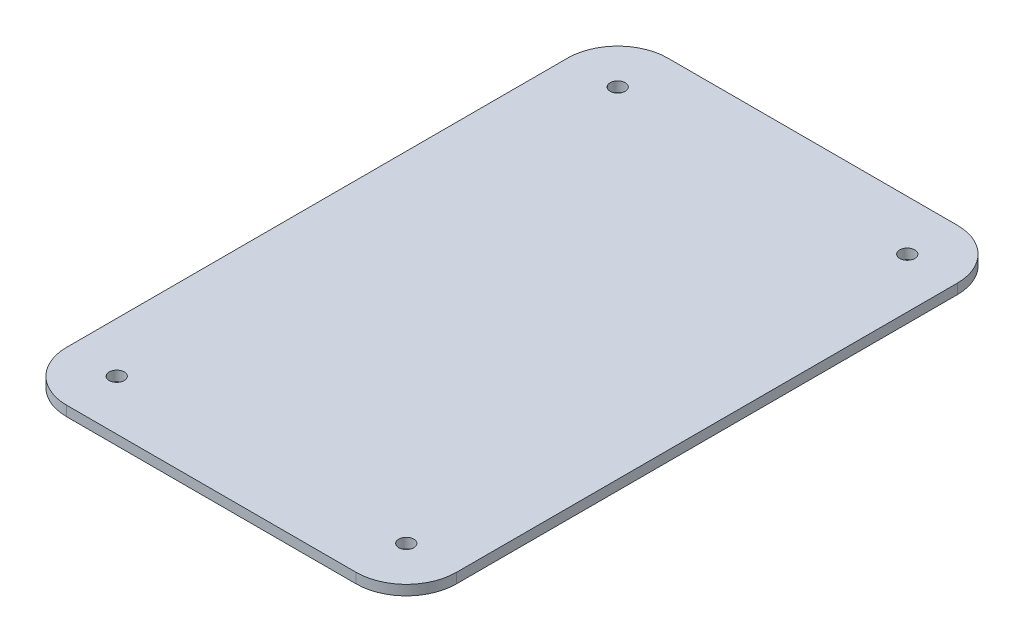
ISO-10303-21;
HEADER;
FILE_DESCRIPTION(('STEP AP214'),'2;1');
FILE_NAME('part.step','',(''),(''),'','','');
FILE_SCHEMA(('AUTOMOTIVE_DESIGN { 1 0 10303 214 1 1 1 1 }'));
ENDSEC;
DATA;
#1=APPLICATION_CONTEXT('core data for automotive mechanical design processes');
#2=APPLICATION_PROTOCOL_DEFINITION('international standard','automotive_design',2000,#1);
#3=PRODUCT_CONTEXT('',#1,'mechanical');
#4=PRODUCT('Part','Part','',(#3));
#5=PRODUCT_RELATED_PRODUCT_CATEGORY('part','',(#4));
#6=PRODUCT_DEFINITION_FORMATION('','',#4);
#7=PRODUCT_DEFINITION_CONTEXT('part definition',#1,'design');
#8=PRODUCT_DEFINITION('design','',#6,#7);
#9=PRODUCT_DEFINITION_SHAPE('','',#8);
#10=(LENGTH_UNIT() NAMED_UNIT(*) SI_UNIT(.MILLI.,.METRE.));
#11=(NAMED_UNIT(*) PLANE_ANGLE_UNIT() SI_UNIT($,.RADIAN.));
#12=(NAMED_UNIT(*) SI_UNIT($,.STERADIAN.) SOLID_ANGLE_UNIT());
#13=UNCERTAINTY_MEASURE_WITH_UNIT(LENGTH_MEASURE(1.E-05),#10,'distance_accuracy_value','');
#14=(GEOMETRIC_REPRESENTATION_CONTEXT(3) GLOBAL_UNCERTAINTY_ASSIGNED_CONTEXT((#13)) GLOBAL_UNIT_ASSIGNED_CONTEXT((#10,
#11,#12)) REPRESENTATION_CONTEXT('',''));
#15=CARTESIAN_POINT('',(0.,0.,0.));
#16=DIRECTION('',(0.,0.,1.));
#17=DIRECTION('',(1.,0.,0.));
#18=AXIS2_PLACEMENT_3D('',#15,#16,#17);
#19=CARTESIAN_POINT('',(-43.369169002165,2.,-87.0692556287286));
#20=DIRECTION('',(1.,0.,0.));
#21=DIRECTION('',(0.,0.,-1.));
#22=AXIS2_PLACEMENT_3D('',#19,#20,#21);
#23=PLANE('',#22);
#24=DIRECTION('',(0.,0.,1.));
#25=VECTOR('',#24,1.);
#26=CARTESIAN_POINT('',(-43.369169002165,2.,-87.0692556287286));
#27=LINE('',#26,#25);
#28=CARTESIAN_POINT('',(-43.369169002165,2.,-77.0692556287286));
#29=VERTEX_POINT('',#28);
#30=CARTESIAN_POINT('',(-43.369169002165,2.,22.9307443712714));
#31=VERTEX_POINT('',#30);
#32=EDGE_CURVE('E125',#29,#31,#27,.T.);
#33=ORIENTED_EDGE('',*,*,#32,.F.);
#34=DIRECTION('',(0.,-1.,0.));
#35=VECTOR('',#34,1.);
#36=CARTESIAN_POINT('',(-43.369169002165,2.,-77.0692556287286));
#37=LINE('',#36,#35);
#38=CARTESIAN_POINT('',(-43.369169002165,0.,-77.0692556287286));
#39=VERTEX_POINT('',#38);
#40=EDGE_CURVE('E110',#29,#39,#37,.T.);
#41=ORIENTED_EDGE('',*,*,#40,.T.);
#42=DIRECTION('',(0.,0.,1.));
#43=VECTOR('',#42,1.);
#44=CARTESIAN_POINT('',(-43.369169002165,0.,-87.0692556287286));
#45=LINE('',#44,#43);
#46=CARTESIAN_POINT('',(-43.369169002165,0.,22.9307443712714));
#47=VERTEX_POINT('',#46);
#48=EDGE_CURVE('E122',#39,#47,#45,.T.);
#49=ORIENTED_EDGE('',*,*,#48,.T.);
#50=DIRECTION('',(0.,-1.,0.));
#51=VECTOR('',#50,1.);
#52=CARTESIAN_POINT('',(-43.369169002165,2.,22.9307443712714));
#53=LINE('',#52,#51);
#54=EDGE_CURVE('E127',#47,#31,#53,.F.);
#55=ORIENTED_EDGE('',*,*,#54,.T.);
#56=EDGE_LOOP('',(#33,#41,#49,#55));
#57=FACE_BOUND('',#56,.T.);
#58=ADVANCED_FACE('F38',(#57),#23,.F.);
#59=CARTESIAN_POINT('',(-43.369169002165,2.,32.9307443712714));
#60=DIRECTION('',(0.,0.,-1.));
#61=DIRECTION('',(-1.,0.,0.));
#62=AXIS2_PLACEMENT_3D('',#59,#60,#61);
#63=PLANE('',#62);
#64=DIRECTION('',(1.,0.,0.));
#65=VECTOR('',#64,1.);
#66=CARTESIAN_POINT('',(-43.369169002165,0.,32.9307443712714));
#67=LINE('',#66,#65);
#68=CARTESIAN_POINT('',(-33.369169002165,0.,32.9307443712714));
#69=VERTEX_POINT('',#68);
#70=CARTESIAN_POINT('',(24.430830997835,0.,32.9307443712714));
#71=VERTEX_POINT('',#70);
#72=EDGE_CURVE('E131',#69,#71,#67,.T.);
#73=ORIENTED_EDGE('',*,*,#72,.T.);
#74=DIRECTION('',(0.,-1.,0.));
#75=VECTOR('',#74,1.);
#76=CARTESIAN_POINT('',(24.430830997835,2.,32.9307443712714));
#77=LINE('',#76,#75);
#78=CARTESIAN_POINT('',(24.430830997835,2.,32.9307443712714));
#79=VERTEX_POINT('',#78);
#80=EDGE_CURVE('E11',#71,#79,#77,.F.);
#81=ORIENTED_EDGE('',*,*,#80,.T.);
#82=DIRECTION('',(1.,0.,0.));
#83=VECTOR('',#82,1.);
#84=CARTESIAN_POINT('',(-43.369169002165,2.,32.9307443712714));
#85=LINE('',#84,#83);
#86=CARTESIAN_POINT('',(-33.369169002165,2.,32.9307443712714));
#87=VERTEX_POINT('',#86);
#88=EDGE_CURVE('E227',#87,#79,#85,.T.);
#89=ORIENTED_EDGE('',*,*,#88,.F.);
#90=DIRECTION('',(0.,-1.,0.));
#91=VECTOR('',#90,1.);
#92=CARTESIAN_POINT('',(-33.369169002165,2.,32.9307443712714));
#93=LINE('',#92,#91);
#94=EDGE_CURVE('E47',#87,#69,#93,.T.);
#95=ORIENTED_EDGE('',*,*,#94,.T.);
#96=EDGE_LOOP('',(#73,#81,#89,#95));
#97=FACE_BOUND('',#96,.T.);
#98=ADVANCED_FACE('F195',(#97),#63,.F.);
#99=CARTESIAN_POINT('',(34.430830997835,2.,-87.0692556287286));
#100=DIRECTION('',(-1.,0.,0.));
#101=DIRECTION('',(0.,0.,1.));
#102=AXIS2_PLACEMENT_3D('',#99,#100,#101);
#103=PLANE('',#102);
#104=DIRECTION('',(0.,0.,-1.));
#105=VECTOR('',#104,1.);
#106=CARTESIAN_POINT('',(34.430830997835,0.,-87.0692556287286));
#107=LINE('',#106,#105);
#108=CARTESIAN_POINT('',(34.430830997835,0.,22.9307443712714));
#109=VERTEX_POINT('',#108);
#110=CARTESIAN_POINT('',(34.430830997835,0.,-77.0692556287286));
#111=VERTEX_POINT('',#110);
#112=EDGE_CURVE('E134',#109,#111,#107,.T.);
#113=ORIENTED_EDGE('',*,*,#112,.T.);
#114=DIRECTION('',(0.,-1.,0.));
#115=VECTOR('',#114,1.);
#116=CARTESIAN_POINT('',(34.430830997835,2.,-77.0692556287286));
#117=LINE('',#116,#115);
#118=CARTESIAN_POINT('',(34.430830997835,2.,-77.0692556287286));
#119=VERTEX_POINT('',#118);
#120=EDGE_CURVE('E55',#111,#119,#117,.F.);
#121=ORIENTED_EDGE('',*,*,#120,.T.);
#122=DIRECTION('',(0.,0.,-1.));
#123=VECTOR('',#122,1.);
#124=CARTESIAN_POINT('',(34.430830997835,2.,-87.0692556287286));
#125=LINE('',#124,#123);
#126=CARTESIAN_POINT('',(34.430830997835,2.,22.9307443712714));
#127=VERTEX_POINT('',#126);
#128=EDGE_CURVE('E220',#127,#119,#125,.T.);
#129=ORIENTED_EDGE('',*,*,#128,.F.);
#130=DIRECTION('',(0.,-1.,0.));
#131=VECTOR('',#130,1.);
#132=CARTESIAN_POINT('',(34.430830997835,2.,22.9307443712714));
#133=LINE('',#132,#131);
#134=EDGE_CURVE('E160',#127,#109,#133,.T.);
#135=ORIENTED_EDGE('',*,*,#134,.T.);
#136=EDGE_LOOP('',(#113,#121,#129,#135));
#137=FACE_BOUND('',#136,.T.);
#138=ADVANCED_FACE('F200',(#137),#103,.F.);
#139=CARTESIAN_POINT('',(-43.369169002165,2.,-87.0692556287286));
#140=DIRECTION('',(0.,0.,1.));
#141=DIRECTION('',(1.,0.,0.));
#142=AXIS2_PLACEMENT_3D('',#139,#140,#141);
#143=PLANE('',#142);
#144=DIRECTION('',(-1.,0.,0.));
#145=VECTOR('',#144,1.);
#146=CARTESIAN_POINT('',(-43.369169002165,0.,-87.0692556287286));
#147=LINE('',#146,#145);
#148=CARTESIAN_POINT('',(24.430830997835,0.,-87.0692556287286));
#149=VERTEX_POINT('',#148);
#150=CARTESIAN_POINT('',(-33.369169002165,0.,-87.0692556287286));
#151=VERTEX_POINT('',#150);
#152=EDGE_CURVE('E143',#149,#151,#147,.T.);
#153=ORIENTED_EDGE('',*,*,#152,.T.);
#154=DIRECTION('',(0.,-1.,0.));
#155=VECTOR('',#154,1.);
#156=CARTESIAN_POINT('',(-33.369169002165,2.,-87.0692556287286));
#157=LINE('',#156,#155);
#158=CARTESIAN_POINT('',(-33.369169002165,2.,-87.0692556287286));
#159=VERTEX_POINT('',#158);
#160=EDGE_CURVE('E111',#151,#159,#157,.F.);
#161=ORIENTED_EDGE('',*,*,#160,.T.);
#162=DIRECTION('',(-1.,0.,0.));
#163=VECTOR('',#162,1.);
#164=CARTESIAN_POINT('',(-43.369169002165,2.,-87.0692556287286));
#165=LINE('',#164,#163);
#166=CARTESIAN_POINT('',(24.430830997835,2.,-87.0692556287286));
#167=VERTEX_POINT('',#166);
#168=EDGE_CURVE('E139',#167,#159,#165,.T.);
#169=ORIENTED_EDGE('',*,*,#168,.F.);
#170=DIRECTION('',(0.,-1.,0.));
#171=VECTOR('',#170,1.);
#172=CARTESIAN_POINT('',(24.430830997835,2.,-87.0692556287286));
#173=LINE('',#172,#171);
#174=EDGE_CURVE('E116',#167,#149,#173,.T.);
#175=ORIENTED_EDGE('',*,*,#174,.T.);
#176=EDGE_LOOP('',(#153,#161,#169,#175));
#177=FACE_BOUND('',#176,.T.);
#178=ADVANCED_FACE('F225',(#177),#143,.F.);
#179=CARTESIAN_POINT('',(0.,2.,0.));
#180=DIRECTION('',(0.,1.,0.));
#181=DIRECTION('',(0.,0.,1.));
#182=AXIS2_PLACEMENT_3D('',#179,#180,#181);
#183=PLANE('',#182);
#184=CARTESIAN_POINT('',(24.430830997835,2.,22.9307443712714));
#185=DIRECTION('',(0.,1.,0.));
#186=DIRECTION('',(0.,0.,1.));
#187=AXIS2_PLACEMENT_3D('',#184,#185,#186);
#188=CIRCLE('',#187,1.5);
#189=CARTESIAN_POINT('',(24.430830997835,2.,24.4307443712714));
#190=VERTEX_POINT('',#189);
#191=EDGE_CURVE('E233',#190,#190,#188,.T.);
#192=ORIENTED_EDGE('',*,*,#191,.F.);
#193=EDGE_LOOP('',(#192));
#194=FACE_BOUND('',#193,.T.);
#195=CARTESIAN_POINT('',(-33.369169002165,2.,-77.0692556287286));
#196=DIRECTION('',(0.,1.,0.));
#197=DIRECTION('',(0.,0.,1.));
#198=AXIS2_PLACEMENT_3D('',#195,#196,#197);
#199=CIRCLE('',#198,1.5);
#200=CARTESIAN_POINT('',(-33.369169002165,2.,-75.5692556287286));
#201=VERTEX_POINT('',#200);
#202=EDGE_CURVE('E234',#201,#201,#199,.T.);
#203=ORIENTED_EDGE('',*,*,#202,.F.);
#204=EDGE_LOOP('',(#203));
#205=FACE_BOUND('',#204,.T.);
#206=CARTESIAN_POINT('',(24.430830997835,2.,-77.0692556287286));
#207=DIRECTION('',(0.,1.,0.));
#208=DIRECTION('',(0.,0.,1.));
#209=AXIS2_PLACEMENT_3D('',#206,#207,#208);
#210=CIRCLE('',#209,1.5);
#211=CARTESIAN_POINT('',(24.430830997835,2.,-75.5692556287286));
#212=VERTEX_POINT('',#211);
#213=EDGE_CURVE('E236',#212,#212,#210,.T.);
#214=ORIENTED_EDGE('',*,*,#213,.F.);
#215=EDGE_LOOP('',(#214));
#216=FACE_BOUND('',#215,.T.);
#217=CARTESIAN_POINT('',(-33.369169002165,2.,22.9307443712714));
#218=DIRECTION('',(0.,1.,0.));
#219=DIRECTION('',(0.,0.,1.));
#220=AXIS2_PLACEMENT_3D('',#217,#218,#219);
#221=CIRCLE('',#220,1.5);
#222=CARTESIAN_POINT('',(-33.369169002165,2.,24.4307443712714));
#223=VERTEX_POINT('',#222);
#224=EDGE_CURVE('E170',#223,#223,#221,.T.);
#225=ORIENTED_EDGE('',*,*,#224,.F.);
#226=EDGE_LOOP('',(#225));
#227=FACE_BOUND('',#226,.T.);
#228=ORIENTED_EDGE('',*,*,#168,.T.);
#229=CARTESIAN_POINT('',(-33.369169002165,2.,-77.0692556287286));
#230=DIRECTION('',(0.,1.,0.));
#231=DIRECTION('',(0.,0.,1.));
#232=AXIS2_PLACEMENT_3D('',#229,#230,#231);
#233=CIRCLE('',#232,10.);
#234=EDGE_CURVE('E158',#159,#29,#233,.T.);
#235=ORIENTED_EDGE('',*,*,#234,.T.);
#236=ORIENTED_EDGE('',*,*,#32,.T.);
#237=CARTESIAN_POINT('',(-33.369169002165,2.,22.9307443712714));
#238=DIRECTION('',(0.,1.,0.));
#239=DIRECTION('',(0.,0.,1.));
#240=AXIS2_PLACEMENT_3D('',#237,#238,#239);
#241=CIRCLE('',#240,10.);
#242=EDGE_CURVE('E153',#31,#87,#241,.T.);
#243=ORIENTED_EDGE('',*,*,#242,.T.);
#244=ORIENTED_EDGE('',*,*,#88,.T.);
#245=CARTESIAN_POINT('',(24.430830997835,2.,22.9307443712714));
#246=DIRECTION('',(0.,1.,0.));
#247=DIRECTION('',(0.,0.,1.));
#248=AXIS2_PLACEMENT_3D('',#245,#246,#247);
#249=CIRCLE('',#248,10.);
#250=EDGE_CURVE('E62',#79,#127,#249,.T.);
#251=ORIENTED_EDGE('',*,*,#250,.T.);
#252=ORIENTED_EDGE('',*,*,#128,.T.);
#253=CARTESIAN_POINT('',(24.430830997835,2.,-77.0692556287286));
#254=DIRECTION('',(0.,1.,0.));
#255=DIRECTION('',(0.,0.,1.));
#256=AXIS2_PLACEMENT_3D('',#253,#254,#255);
#257=CIRCLE('',#256,10.);
#258=EDGE_CURVE('E156',#119,#167,#257,.T.);
#259=ORIENTED_EDGE('',*,*,#258,.T.);
#260=EDGE_LOOP('',(#228,#235,#236,#243,#244,#251,#252,#259));
#261=FACE_BOUND('',#260,.T.);
#262=ADVANCED_FACE('F243',(#194,#205,#216,#227,#261),#183,.T.);
#263=CARTESIAN_POINT('',(0.,0.,0.));
#264=DIRECTION('',(0.,1.,0.));
#265=DIRECTION('',(0.,0.,1.));
#266=AXIS2_PLACEMENT_3D('',#263,#264,#265);
#267=PLANE('',#266);
#268=CARTESIAN_POINT('',(24.430830997835,0.,22.9307443712714));
#269=DIRECTION('',(0.,1.,0.));
#270=DIRECTION('',(0.,0.,1.));
#271=AXIS2_PLACEMENT_3D('',#268,#269,#270);
#272=CIRCLE('',#271,1.5);
#273=CARTESIAN_POINT('',(24.430830997835,0.,24.4307443712714));
#274=VERTEX_POINT('',#273);
#275=EDGE_CURVE('E42',#274,#274,#272,.T.);
#276=ORIENTED_EDGE('',*,*,#275,.T.);
#277=EDGE_LOOP('',(#276));
#278=FACE_BOUND('',#277,.T.);
#279=CARTESIAN_POINT('',(-33.369169002165,0.,-77.0692556287286));
#280=DIRECTION('',(0.,1.,0.));
#281=DIRECTION('',(0.,0.,1.));
#282=AXIS2_PLACEMENT_3D('',#279,#280,#281);
#283=CIRCLE('',#282,1.5);
#284=CARTESIAN_POINT('',(-33.369169002165,0.,-75.5692556287286));
#285=VERTEX_POINT('',#284);
#286=EDGE_CURVE('E137',#285,#285,#283,.T.);
#287=ORIENTED_EDGE('',*,*,#286,.T.);
#288=EDGE_LOOP('',(#287));
#289=FACE_BOUND('',#288,.T.);
#290=CARTESIAN_POINT('',(24.430830997835,0.,-77.0692556287286));
#291=DIRECTION('',(0.,1.,0.));
#292=DIRECTION('',(0.,0.,1.));
#293=AXIS2_PLACEMENT_3D('',#290,#291,#292);
#294=CIRCLE('',#293,1.5);
#295=CARTESIAN_POINT('',(24.430830997835,0.,-75.5692556287286));
#296=VERTEX_POINT('',#295);
#297=EDGE_CURVE('E169',#296,#296,#294,.T.);
#298=ORIENTED_EDGE('',*,*,#297,.T.);
#299=EDGE_LOOP('',(#298));
#300=FACE_BOUND('',#299,.T.);
#301=CARTESIAN_POINT('',(-33.369169002165,0.,22.9307443712714));
#302=DIRECTION('',(0.,1.,0.));
#303=DIRECTION('',(0.,0.,1.));
#304=AXIS2_PLACEMENT_3D('',#301,#302,#303);
#305=CIRCLE('',#304,1.5);
#306=CARTESIAN_POINT('',(-33.369169002165,0.,24.4307443712714));
#307=VERTEX_POINT('',#306);
#308=EDGE_CURVE('E166',#307,#307,#305,.T.);
#309=ORIENTED_EDGE('',*,*,#308,.T.);
#310=EDGE_LOOP('',(#309));
#311=FACE_BOUND('',#310,.T.);
#312=ORIENTED_EDGE('',*,*,#48,.F.);
#313=CARTESIAN_POINT('',(-33.369169002165,0.,-77.0692556287286));
#314=DIRECTION('',(0.,1.,0.));
#315=DIRECTION('',(0.,0.,1.));
#316=AXIS2_PLACEMENT_3D('',#313,#314,#315);
#317=CIRCLE('',#316,10.);
#318=EDGE_CURVE('E106',#39,#151,#317,.F.);
#319=ORIENTED_EDGE('',*,*,#318,.T.);
#320=ORIENTED_EDGE('',*,*,#152,.F.);
#321=CARTESIAN_POINT('',(24.430830997835,0.,-77.0692556287286));
#322=DIRECTION('',(0.,1.,0.));
#323=DIRECTION('',(0.,0.,1.));
#324=AXIS2_PLACEMENT_3D('',#321,#322,#323);
#325=CIRCLE('',#324,10.);
#326=EDGE_CURVE('E117',#149,#111,#325,.F.);
#327=ORIENTED_EDGE('',*,*,#326,.T.);
#328=ORIENTED_EDGE('',*,*,#112,.F.);
#329=CARTESIAN_POINT('',(24.430830997835,0.,22.9307443712714));
#330=DIRECTION('',(0.,1.,0.));
#331=DIRECTION('',(0.,0.,1.));
#332=AXIS2_PLACEMENT_3D('',#329,#330,#331);
#333=CIRCLE('',#332,10.);
#334=EDGE_CURVE('E147',#109,#71,#333,.F.);
#335=ORIENTED_EDGE('',*,*,#334,.T.);
#336=ORIENTED_EDGE('',*,*,#72,.F.);
#337=CARTESIAN_POINT('',(-33.369169002165,0.,22.9307443712714));
#338=DIRECTION('',(0.,1.,0.));
#339=DIRECTION('',(0.,0.,1.));
#340=AXIS2_PLACEMENT_3D('',#337,#338,#339);
#341=CIRCLE('',#340,10.);
#342=EDGE_CURVE('E126',#69,#47,#341,.F.);
#343=ORIENTED_EDGE('',*,*,#342,.T.);
#344=EDGE_LOOP('',(#312,#319,#320,#327,#328,#335,#336,#343));
#345=FACE_BOUND('',#344,.T.);
#346=ADVANCED_FACE('F129',(#278,#289,#300,#311,#345),#267,.F.);
#347=CARTESIAN_POINT('',(-33.369169002165,2.,-77.0692556287286));
#348=DIRECTION('',(0.,-1.,0.));
#349=DIRECTION('',(0.,0.,-1.));
#350=AXIS2_PLACEMENT_3D('',#347,#348,#349);
#351=CYLINDRICAL_SURFACE('',#350,10.);
#352=ORIENTED_EDGE('',*,*,#234,.F.);
#353=ORIENTED_EDGE('',*,*,#160,.F.);
#354=ORIENTED_EDGE('',*,*,#318,.F.);
#355=ORIENTED_EDGE('',*,*,#40,.F.);
#356=EDGE_LOOP('',(#352,#353,#354,#355));
#357=FACE_BOUND('',#356,.T.);
#358=ADVANCED_FACE('F109',(#357),#351,.T.);
#359=CARTESIAN_POINT('',(24.430830997835,2.,-77.0692556287286));
#360=DIRECTION('',(0.,-1.,0.));
#361=DIRECTION('',(0.,0.,-1.));
#362=AXIS2_PLACEMENT_3D('',#359,#360,#361);
#363=CYLINDRICAL_SURFACE('',#362,10.);
#364=ORIENTED_EDGE('',*,*,#258,.F.);
#365=ORIENTED_EDGE('',*,*,#120,.F.);
#366=ORIENTED_EDGE('',*,*,#326,.F.);
#367=ORIENTED_EDGE('',*,*,#174,.F.);
#368=EDGE_LOOP('',(#364,#365,#366,#367));
#369=FACE_BOUND('',#368,.T.);
#370=ADVANCED_FACE('F207',(#369),#363,.T.);
#371=CARTESIAN_POINT('',(24.430830997835,2.,22.9307443712714));
#372=DIRECTION('',(0.,-1.,0.));
#373=DIRECTION('',(0.,0.,-1.));
#374=AXIS2_PLACEMENT_3D('',#371,#372,#373);
#375=CYLINDRICAL_SURFACE('',#374,10.);
#376=ORIENTED_EDGE('',*,*,#250,.F.);
#377=ORIENTED_EDGE('',*,*,#80,.F.);
#378=ORIENTED_EDGE('',*,*,#334,.F.);
#379=ORIENTED_EDGE('',*,*,#134,.F.);
#380=EDGE_LOOP('',(#376,#377,#378,#379));
#381=FACE_BOUND('',#380,.T.);
#382=ADVANCED_FACE('F209',(#381),#375,.T.);
#383=CARTESIAN_POINT('',(-33.369169002165,2.,22.9307443712714));
#384=DIRECTION('',(0.,-1.,0.));
#385=DIRECTION('',(0.,0.,-1.));
#386=AXIS2_PLACEMENT_3D('',#383,#384,#385);
#387=CYLINDRICAL_SURFACE('',#386,10.);
#388=ORIENTED_EDGE('',*,*,#242,.F.);
#389=ORIENTED_EDGE('',*,*,#54,.F.);
#390=ORIENTED_EDGE('',*,*,#342,.F.);
#391=ORIENTED_EDGE('',*,*,#94,.F.);
#392=EDGE_LOOP('',(#388,#389,#390,#391));
#393=FACE_BOUND('',#392,.T.);
#394=ADVANCED_FACE('F40',(#393),#387,.T.);
#395=CARTESIAN_POINT('',(-33.369169002165,-19.,22.9307443712714));
#396=DIRECTION('',(0.,1.,0.));
#397=DIRECTION('',(0.,0.,1.));
#398=AXIS2_PLACEMENT_3D('',#395,#396,#397);
#399=CYLINDRICAL_SURFACE('',#398,1.5);
#400=CARTESIAN_POINT('',(-33.369169002165,2.,24.4307443712714));
#401=CARTESIAN_POINT('',(-33.369169002165,1.97916666666667,24.4307443712714));
#402=CARTESIAN_POINT('',(-33.369169002165,1.95833333333333,24.4307443712714));
#403=CARTESIAN_POINT('',(-33.369169002165,1.91666666666666,24.4307443712714));
#404=CARTESIAN_POINT('',(-33.369169002165,1.89583333333333,24.4307443712714));
#405=CARTESIAN_POINT('',(-33.369169002165,1.85416666666666,24.4307443712714));
#406=CARTESIAN_POINT('',(-33.369169002165,1.83333333333333,24.4307443712714));
#407=CARTESIAN_POINT('',(-33.369169002165,1.79166666666666,24.4307443712714));
#408=CARTESIAN_POINT('',(-33.369169002165,1.77083333333333,24.4307443712714));
#409=CARTESIAN_POINT('',(-33.369169002165,1.72916666666666,24.4307443712714));
#410=CARTESIAN_POINT('',(-33.369169002165,1.70833333333333,24.4307443712714));
#411=CARTESIAN_POINT('',(-33.369169002165,1.66666666666666,24.4307443712714));
#412=CARTESIAN_POINT('',(-33.369169002165,1.64583333333333,24.4307443712714));
#413=CARTESIAN_POINT('',(-33.369169002165,1.60416666666666,24.4307443712714));
#414=CARTESIAN_POINT('',(-33.369169002165,1.58333333333333,24.4307443712714));
#415=CARTESIAN_POINT('',(-33.369169002165,1.54166666666666,24.4307443712714));
#416=CARTESIAN_POINT('',(-33.369169002165,1.52083333333333,24.4307443712714));
#417=CARTESIAN_POINT('',(-33.369169002165,1.47916666666666,24.4307443712714));
#418=CARTESIAN_POINT('',(-33.369169002165,1.45833333333333,24.4307443712714));
#419=CARTESIAN_POINT('',(-33.369169002165,1.41666666666666,24.4307443712714));
#420=CARTESIAN_POINT('',(-33.369169002165,1.39583333333333,24.4307443712714));
#421=CARTESIAN_POINT('',(-33.369169002165,1.35416666666666,24.4307443712714));
#422=CARTESIAN_POINT('',(-33.369169002165,1.33333333333333,24.4307443712714));
#423=CARTESIAN_POINT('',(-33.369169002165,1.29166666666666,24.4307443712714));
#424=CARTESIAN_POINT('',(-33.369169002165,1.27083333333333,24.4307443712714));
#425=CARTESIAN_POINT('',(-33.369169002165,1.22916666666666,24.4307443712714));
#426=CARTESIAN_POINT('',(-33.369169002165,1.20833333333333,24.4307443712714));
#427=CARTESIAN_POINT('',(-33.369169002165,1.16666666666666,24.4307443712714));
#428=CARTESIAN_POINT('',(-33.369169002165,1.14583333333333,24.4307443712714));
#429=CARTESIAN_POINT('',(-33.369169002165,1.10416666666666,24.4307443712714));
#430=CARTESIAN_POINT('',(-33.369169002165,1.08333333333333,24.4307443712714));
#431=CARTESIAN_POINT('',(-33.369169002165,1.04166666666666,24.4307443712714));
#432=CARTESIAN_POINT('',(-33.369169002165,1.02083333333333,24.4307443712714));
#433=CARTESIAN_POINT('',(-33.369169002165,0.979166666666664,24.4307443712714));
#434=CARTESIAN_POINT('',(-33.369169002165,0.958333333333331,24.4307443712714));
#435=CARTESIAN_POINT('',(-33.369169002165,0.916666666666664,24.4307443712714));
#436=CARTESIAN_POINT('',(-33.369169002165,0.895833333333331,24.4307443712714));
#437=CARTESIAN_POINT('',(-33.369169002165,0.854166666666664,24.4307443712714));
#438=CARTESIAN_POINT('',(-33.369169002165,0.833333333333331,24.4307443712714));
#439=CARTESIAN_POINT('',(-33.369169002165,0.791666666666664,24.4307443712714));
#440=CARTESIAN_POINT('',(-33.369169002165,0.77083333333333,24.4307443712714));
#441=CARTESIAN_POINT('',(-33.369169002165,0.729166666666664,24.4307443712714));
#442=CARTESIAN_POINT('',(-33.369169002165,0.70833333333333,24.4307443712714));
#443=CARTESIAN_POINT('',(-33.369169002165,0.666666666666664,24.4307443712714));
#444=CARTESIAN_POINT('',(-33.369169002165,0.64583333333333,24.4307443712714));
#445=CARTESIAN_POINT('',(-33.369169002165,0.604166666666664,24.4307443712714));
#446=CARTESIAN_POINT('',(-33.369169002165,0.58333333333333,24.4307443712714));
#447=CARTESIAN_POINT('',(-33.369169002165,0.541666666666664,24.4307443712714));
#448=CARTESIAN_POINT('',(-33.369169002165,0.52083333333333,24.4307443712714));
#449=CARTESIAN_POINT('',(-33.369169002165,0.479166666666664,24.4307443712714));
#450=CARTESIAN_POINT('',(-33.369169002165,0.45833333333333,24.4307443712714));
#451=CARTESIAN_POINT('',(-33.369169002165,0.416666666666664,24.4307443712714));
#452=CARTESIAN_POINT('',(-33.369169002165,0.39583333333333,24.4307443712714));
#453=CARTESIAN_POINT('',(-33.369169002165,0.354166666666664,24.4307443712714));
#454=CARTESIAN_POINT('',(-33.369169002165,0.33333333333333,24.4307443712714));
#455=CARTESIAN_POINT('',(-33.369169002165,0.291666666666663,24.4307443712714));
#456=CARTESIAN_POINT('',(-33.369169002165,0.27083333333333,24.4307443712714));
#457=CARTESIAN_POINT('',(-33.369169002165,0.229166666666663,24.4307443712714));
#458=CARTESIAN_POINT('',(-33.369169002165,0.20833333333333,24.4307443712714));
#459=CARTESIAN_POINT('',(-33.369169002165,0.166666666666663,24.4307443712714));
#460=CARTESIAN_POINT('',(-33.369169002165,0.14583333333333,24.4307443712714));
#461=CARTESIAN_POINT('',(-33.369169002165,0.104166666666663,24.4307443712714));
#462=CARTESIAN_POINT('',(-33.369169002165,0.0833333333333299,24.4307443712714));
#463=CARTESIAN_POINT('',(-33.369169002165,0.0416666666666632,24.4307443712714));
#464=CARTESIAN_POINT('',(-33.369169002165,0.0208333333333299,24.4307443712714));
#465=CARTESIAN_POINT('',(-33.369169002165,0.,24.4307443712714));
#466=B_SPLINE_CURVE_WITH_KNOTS('',3,(#400,#401,#402,#403,#404,#405,#406,#407,#408,#409,#410,
#411,#412,#413,#414,#415,#416,#417,#418,#419,#420,#421,#422,#423,#424,#425,#426,#427,#428,#429,
#430,#431,#432,#433,#434,#435,#436,#437,#438,#439,#440,#441,#442,#443,#444,#445,#446,#447,#448,
#449,#450,#451,#452,#453,#454,#455,#456,#457,#458,#459,#460,#461,#462,#463,#464,#465),
.UNSPECIFIED.,.F.,.F.,(4,2,2,2,2,2,2,2,2,2,2,2,2,2,2,2,2,2,2,2,2,2,2,2,2,2,2,2,2,2,2,2,4),(0.,
0.0625000000000001,0.125,0.1875,0.25,0.3125,0.375,0.4375,0.5,0.5625,0.625000000000001,
0.687500000000001,0.750000000000001,0.812500000000001,0.875000000000001,0.937500000000001,1.,
1.0625,1.125,1.1875,1.25,1.3125,1.375,1.4375,1.5,1.5625,1.625,1.6875,1.75,1.8125,1.875,1.9375,
2.),.UNSPECIFIED.);
#467=EDGE_CURVE('BSEAM189',#223,#307,#466,.T.);
#468=ORIENTED_EDGE('',*,*,#224,.T.);
#469=ORIENTED_EDGE('',*,*,#308,.F.);
#470=ORIENTED_EDGE('',*,*,#467,.T.);
#471=ORIENTED_EDGE('',*,*,#467,.F.);
#472=EDGE_LOOP('',(#468,#470,#469,#471));
#473=FACE_BOUND('',#472,.T.);
#474=ADVANCED_FACE('F189',(#473),#399,.F.);
#475=CARTESIAN_POINT('',(24.430830997835,-19.,-77.0692556287286));
#476=DIRECTION('',(0.,1.,0.));
#477=DIRECTION('',(0.,0.,1.));
#478=AXIS2_PLACEMENT_3D('',#475,#476,#477);
#479=CYLINDRICAL_SURFACE('',#478,1.5);
#480=CARTESIAN_POINT('',(24.430830997835,2.,-75.5692556287286));
#481=CARTESIAN_POINT('',(24.430830997835,1.97916666666667,-75.5692556287286));
#482=CARTESIAN_POINT('',(24.430830997835,1.95833333333333,-75.5692556287286));
#483=CARTESIAN_POINT('',(24.430830997835,1.91666666666666,-75.5692556287286));
#484=CARTESIAN_POINT('',(24.430830997835,1.89583333333333,-75.5692556287286));
#485=CARTESIAN_POINT('',(24.430830997835,1.85416666666666,-75.5692556287286));
#486=CARTESIAN_POINT('',(24.430830997835,1.83333333333333,-75.5692556287286));
#487=CARTESIAN_POINT('',(24.430830997835,1.79166666666666,-75.5692556287286));
#488=CARTESIAN_POINT('',(24.430830997835,1.77083333333333,-75.5692556287286));
#489=CARTESIAN_POINT('',(24.430830997835,1.72916666666666,-75.5692556287286));
#490=CARTESIAN_POINT('',(24.430830997835,1.70833333333333,-75.5692556287286));
#491=CARTESIAN_POINT('',(24.430830997835,1.66666666666666,-75.5692556287286));
#492=CARTESIAN_POINT('',(24.430830997835,1.64583333333333,-75.5692556287286));
#493=CARTESIAN_POINT('',(24.430830997835,1.60416666666666,-75.5692556287286));
#494=CARTESIAN_POINT('',(24.430830997835,1.58333333333333,-75.5692556287286));
#495=CARTESIAN_POINT('',(24.430830997835,1.54166666666666,-75.5692556287286));
#496=CARTESIAN_POINT('',(24.430830997835,1.52083333333333,-75.5692556287286));
#497=CARTESIAN_POINT('',(24.430830997835,1.47916666666666,-75.5692556287286));
#498=CARTESIAN_POINT('',(24.430830997835,1.45833333333333,-75.5692556287286));
#499=CARTESIAN_POINT('',(24.430830997835,1.41666666666666,-75.5692556287286));
#500=CARTESIAN_POINT('',(24.430830997835,1.39583333333333,-75.5692556287286));
#501=CARTESIAN_POINT('',(24.430830997835,1.35416666666666,-75.5692556287286));
#502=CARTESIAN_POINT('',(24.430830997835,1.33333333333333,-75.5692556287286));
#503=CARTESIAN_POINT('',(24.430830997835,1.29166666666666,-75.5692556287286));
#504=CARTESIAN_POINT('',(24.430830997835,1.27083333333333,-75.5692556287286));
#505=CARTESIAN_POINT('',(24.430830997835,1.22916666666666,-75.5692556287286));
#506=CARTESIAN_POINT('',(24.430830997835,1.20833333333333,-75.5692556287286));
#507=CARTESIAN_POINT('',(24.430830997835,1.16666666666666,-75.5692556287286));
#508=CARTESIAN_POINT('',(24.430830997835,1.14583333333333,-75.5692556287286));
#509=CARTESIAN_POINT('',(24.430830997835,1.10416666666666,-75.5692556287286));
#510=CARTESIAN_POINT('',(24.430830997835,1.08333333333333,-75.5692556287286));
#511=CARTESIAN_POINT('',(24.430830997835,1.04166666666666,-75.5692556287286));
#512=CARTESIAN_POINT('',(24.430830997835,1.02083333333333,-75.5692556287286));
#513=CARTESIAN_POINT('',(24.430830997835,0.979166666666664,-75.5692556287286));
#514=CARTESIAN_POINT('',(24.430830997835,0.958333333333331,-75.5692556287286));
#515=CARTESIAN_POINT('',(24.430830997835,0.916666666666664,-75.5692556287286));
#516=CARTESIAN_POINT('',(24.430830997835,0.895833333333331,-75.5692556287286));
#517=CARTESIAN_POINT('',(24.430830997835,0.854166666666664,-75.5692556287286));
#518=CARTESIAN_POINT('',(24.430830997835,0.833333333333331,-75.5692556287286));
#519=CARTESIAN_POINT('',(24.430830997835,0.791666666666664,-75.5692556287286));
#520=CARTESIAN_POINT('',(24.430830997835,0.77083333333333,-75.5692556287286));
#521=CARTESIAN_POINT('',(24.430830997835,0.729166666666664,-75.5692556287286));
#522=CARTESIAN_POINT('',(24.430830997835,0.70833333333333,-75.5692556287286));
#523=CARTESIAN_POINT('',(24.430830997835,0.666666666666664,-75.5692556287286));
#524=CARTESIAN_POINT('',(24.430830997835,0.64583333333333,-75.5692556287286));
#525=CARTESIAN_POINT('',(24.430830997835,0.604166666666664,-75.5692556287286));
#526=CARTESIAN_POINT('',(24.430830997835,0.58333333333333,-75.5692556287286));
#527=CARTESIAN_POINT('',(24.430830997835,0.541666666666664,-75.5692556287286));
#528=CARTESIAN_POINT('',(24.430830997835,0.52083333333333,-75.5692556287286));
#529=CARTESIAN_POINT('',(24.430830997835,0.479166666666664,-75.5692556287286));
#530=CARTESIAN_POINT('',(24.430830997835,0.45833333333333,-75.5692556287286));
#531=CARTESIAN_POINT('',(24.430830997835,0.416666666666664,-75.5692556287286));
#532=CARTESIAN_POINT('',(24.430830997835,0.39583333333333,-75.5692556287286));
#533=CARTESIAN_POINT('',(24.430830997835,0.354166666666664,-75.5692556287286));
#534=CARTESIAN_POINT('',(24.430830997835,0.33333333333333,-75.5692556287286));
#535=CARTESIAN_POINT('',(24.430830997835,0.291666666666663,-75.5692556287286));
#536=CARTESIAN_POINT('',(24.430830997835,0.27083333333333,-75.5692556287286));
#537=CARTESIAN_POINT('',(24.430830997835,0.229166666666663,-75.5692556287286));
#538=CARTESIAN_POINT('',(24.430830997835,0.20833333333333,-75.5692556287286));
#539=CARTESIAN_POINT('',(24.430830997835,0.166666666666663,-75.5692556287286));
#540=CARTESIAN_POINT('',(24.430830997835,0.14583333333333,-75.5692556287286));
#541=CARTESIAN_POINT('',(24.430830997835,0.104166666666663,-75.5692556287286));
#542=CARTESIAN_POINT('',(24.430830997835,0.0833333333333299,-75.5692556287286));
#543=CARTESIAN_POINT('',(24.430830997835,0.0416666666666632,-75.5692556287286));
#544=CARTESIAN_POINT('',(24.430830997835,0.0208333333333299,-75.5692556287286));
#545=CARTESIAN_POINT('',(24.430830997835,0.,-75.5692556287286));
#546=B_SPLINE_CURVE_WITH_KNOTS('',3,(#480,#481,#482,#483,#484,#485,#486,#487,#488,#489,#490,
#491,#492,#493,#494,#495,#496,#497,#498,#499,#500,#501,#502,#503,#504,#505,#506,#507,#508,#509,
#510,#511,#512,#513,#514,#515,#516,#517,#518,#519,#520,#521,#522,#523,#524,#525,#526,#527,#528,
#529,#530,#531,#532,#533,#534,#535,#536,#537,#538,#539,#540,#541,#542,#543,#544,#545),
.UNSPECIFIED.,.F.,.F.,(4,2,2,2,2,2,2,2,2,2,2,2,2,2,2,2,2,2,2,2,2,2,2,2,2,2,2,2,2,2,2,2,4),(0.,
0.0625000000000001,0.125,0.1875,0.25,0.3125,0.375,0.4375,0.5,0.5625,0.625000000000001,
0.687500000000001,0.750000000000001,0.812500000000001,0.875000000000001,0.937500000000001,1.,
1.0625,1.125,1.1875,1.25,1.3125,1.375,1.4375,1.5,1.5625,1.625,1.6875,1.75,1.8125,1.875,1.9375,
2.),.UNSPECIFIED.);
#547=EDGE_CURVE('BSEAM180',#212,#296,#546,.T.);
#548=ORIENTED_EDGE('',*,*,#213,.T.);
#549=ORIENTED_EDGE('',*,*,#297,.F.);
#550=ORIENTED_EDGE('',*,*,#547,.T.);
#551=ORIENTED_EDGE('',*,*,#547,.F.);
#552=EDGE_LOOP('',(#548,#550,#549,#551));
#553=FACE_BOUND('',#552,.T.);
#554=ADVANCED_FACE('F180',(#553),#479,.F.);
#555=CARTESIAN_POINT('',(-33.369169002165,-19.,-77.0692556287286));
#556=DIRECTION('',(0.,1.,0.));
#557=DIRECTION('',(0.,0.,1.));
#558=AXIS2_PLACEMENT_3D('',#555,#556,#557);
#559=CYLINDRICAL_SURFACE('',#558,1.5);
#560=CARTESIAN_POINT('',(-33.369169002165,2.,-75.5692556287286));
#561=CARTESIAN_POINT('',(-33.369169002165,1.97916666666667,-75.5692556287286));
#562=CARTESIAN_POINT('',(-33.369169002165,1.95833333333333,-75.5692556287286));
#563=CARTESIAN_POINT('',(-33.369169002165,1.91666666666666,-75.5692556287286));
#564=CARTESIAN_POINT('',(-33.369169002165,1.89583333333333,-75.5692556287286));
#565=CARTESIAN_POINT('',(-33.369169002165,1.85416666666666,-75.5692556287286));
#566=CARTESIAN_POINT('',(-33.369169002165,1.83333333333333,-75.5692556287286));
#567=CARTESIAN_POINT('',(-33.369169002165,1.79166666666666,-75.5692556287286));
#568=CARTESIAN_POINT('',(-33.369169002165,1.77083333333333,-75.5692556287286));
#569=CARTESIAN_POINT('',(-33.369169002165,1.72916666666666,-75.5692556287286));
#570=CARTESIAN_POINT('',(-33.369169002165,1.70833333333333,-75.5692556287286));
#571=CARTESIAN_POINT('',(-33.369169002165,1.66666666666666,-75.5692556287286));
#572=CARTESIAN_POINT('',(-33.369169002165,1.64583333333333,-75.5692556287286));
#573=CARTESIAN_POINT('',(-33.369169002165,1.60416666666666,-75.5692556287286));
#574=CARTESIAN_POINT('',(-33.369169002165,1.58333333333333,-75.5692556287286));
#575=CARTESIAN_POINT('',(-33.369169002165,1.54166666666666,-75.5692556287286));
#576=CARTESIAN_POINT('',(-33.369169002165,1.52083333333333,-75.5692556287286));
#577=CARTESIAN_POINT('',(-33.369169002165,1.47916666666666,-75.5692556287286));
#578=CARTESIAN_POINT('',(-33.369169002165,1.45833333333333,-75.5692556287286));
#579=CARTESIAN_POINT('',(-33.369169002165,1.41666666666666,-75.5692556287286));
#580=CARTESIAN_POINT('',(-33.369169002165,1.39583333333333,-75.5692556287286));
#581=CARTESIAN_POINT('',(-33.369169002165,1.35416666666666,-75.5692556287286));
#582=CARTESIAN_POINT('',(-33.369169002165,1.33333333333333,-75.5692556287286));
#583=CARTESIAN_POINT('',(-33.369169002165,1.29166666666666,-75.5692556287286));
#584=CARTESIAN_POINT('',(-33.369169002165,1.27083333333333,-75.5692556287286));
#585=CARTESIAN_POINT('',(-33.369169002165,1.22916666666666,-75.5692556287286));
#586=CARTESIAN_POINT('',(-33.369169002165,1.20833333333333,-75.5692556287286));
#587=CARTESIAN_POINT('',(-33.369169002165,1.16666666666666,-75.5692556287286));
#588=CARTESIAN_POINT('',(-33.369169002165,1.14583333333333,-75.5692556287286));
#589=CARTESIAN_POINT('',(-33.369169002165,1.10416666666666,-75.5692556287286));
#590=CARTESIAN_POINT('',(-33.369169002165,1.08333333333333,-75.5692556287286));
#591=CARTESIAN_POINT('',(-33.369169002165,1.04166666666666,-75.5692556287286));
#592=CARTESIAN_POINT('',(-33.369169002165,1.02083333333333,-75.5692556287286));
#593=CARTESIAN_POINT('',(-33.369169002165,0.979166666666664,-75.5692556287286));
#594=CARTESIAN_POINT('',(-33.369169002165,0.958333333333331,-75.5692556287286));
#595=CARTESIAN_POINT('',(-33.369169002165,0.916666666666664,-75.5692556287286));
#596=CARTESIAN_POINT('',(-33.369169002165,0.895833333333331,-75.5692556287286));
#597=CARTESIAN_POINT('',(-33.369169002165,0.854166666666664,-75.5692556287286));
#598=CARTESIAN_POINT('',(-33.369169002165,0.833333333333331,-75.5692556287286));
#599=CARTESIAN_POINT('',(-33.369169002165,0.791666666666664,-75.5692556287286));
#600=CARTESIAN_POINT('',(-33.369169002165,0.77083333333333,-75.5692556287286));
#601=CARTESIAN_POINT('',(-33.369169002165,0.729166666666664,-75.5692556287286));
#602=CARTESIAN_POINT('',(-33.369169002165,0.70833333333333,-75.5692556287286));
#603=CARTESIAN_POINT('',(-33.369169002165,0.666666666666664,-75.5692556287286));
#604=CARTESIAN_POINT('',(-33.369169002165,0.64583333333333,-75.5692556287286));
#605=CARTESIAN_POINT('',(-33.369169002165,0.604166666666664,-75.5692556287286));
#606=CARTESIAN_POINT('',(-33.369169002165,0.58333333333333,-75.5692556287286));
#607=CARTESIAN_POINT('',(-33.369169002165,0.541666666666664,-75.5692556287286));
#608=CARTESIAN_POINT('',(-33.369169002165,0.52083333333333,-75.5692556287286));
#609=CARTESIAN_POINT('',(-33.369169002165,0.479166666666664,-75.5692556287286));
#610=CARTESIAN_POINT('',(-33.369169002165,0.45833333333333,-75.5692556287286));
#611=CARTESIAN_POINT('',(-33.369169002165,0.416666666666664,-75.5692556287286));
#612=CARTESIAN_POINT('',(-33.369169002165,0.39583333333333,-75.5692556287286));
#613=CARTESIAN_POINT('',(-33.369169002165,0.354166666666664,-75.5692556287286));
#614=CARTESIAN_POINT('',(-33.369169002165,0.33333333333333,-75.5692556287286));
#615=CARTESIAN_POINT('',(-33.369169002165,0.291666666666663,-75.5692556287286));
#616=CARTESIAN_POINT('',(-33.369169002165,0.27083333333333,-75.5692556287286));
#617=CARTESIAN_POINT('',(-33.369169002165,0.229166666666663,-75.5692556287286));
#618=CARTESIAN_POINT('',(-33.369169002165,0.20833333333333,-75.5692556287286));
#619=CARTESIAN_POINT('',(-33.369169002165,0.166666666666663,-75.5692556287286));
#620=CARTESIAN_POINT('',(-33.369169002165,0.14583333333333,-75.5692556287286));
#621=CARTESIAN_POINT('',(-33.369169002165,0.104166666666663,-75.5692556287286));
#622=CARTESIAN_POINT('',(-33.369169002165,0.0833333333333299,-75.5692556287286));
#623=CARTESIAN_POINT('',(-33.369169002165,0.0416666666666632,-75.5692556287286));
#624=CARTESIAN_POINT('',(-33.369169002165,0.0208333333333299,-75.5692556287286));
#625=CARTESIAN_POINT('',(-33.369169002165,0.,-75.5692556287286));
#626=B_SPLINE_CURVE_WITH_KNOTS('',3,(#560,#561,#562,#563,#564,#565,#566,#567,#568,#569,#570,
#571,#572,#573,#574,#575,#576,#577,#578,#579,#580,#581,#582,#583,#584,#585,#586,#587,#588,#589,
#590,#591,#592,#593,#594,#595,#596,#597,#598,#599,#600,#601,#602,#603,#604,#605,#606,#607,#608,
#609,#610,#611,#612,#613,#614,#615,#616,#617,#618,#619,#620,#621,#622,#623,#624,#625),
.UNSPECIFIED.,.F.,.F.,(4,2,2,2,2,2,2,2,2,2,2,2,2,2,2,2,2,2,2,2,2,2,2,2,2,2,2,2,2,2,2,2,4),(0.,
0.0625000000000001,0.125,0.1875,0.25,0.3125,0.375,0.4375,0.5,0.5625,0.625000000000001,
0.687500000000001,0.750000000000001,0.812500000000001,0.875000000000001,0.937500000000001,1.,
1.0625,1.125,1.1875,1.25,1.3125,1.375,1.4375,1.5,1.5625,1.625,1.6875,1.75,1.8125,1.875,1.9375,
2.),.UNSPECIFIED.);
#627=EDGE_CURVE('BSEAM177',#201,#285,#626,.T.);
#628=ORIENTED_EDGE('',*,*,#202,.T.);
#629=ORIENTED_EDGE('',*,*,#286,.F.);
#630=ORIENTED_EDGE('',*,*,#627,.T.);
#631=ORIENTED_EDGE('',*,*,#627,.F.);
#632=EDGE_LOOP('',(#628,#630,#629,#631));
#633=FACE_BOUND('',#632,.T.);
#634=ADVANCED_FACE('F177',(#633),#559,.F.);
#635=CARTESIAN_POINT('',(24.430830997835,-19.,22.9307443712714));
#636=DIRECTION('',(0.,1.,0.));
#637=DIRECTION('',(0.,0.,1.));
#638=AXIS2_PLACEMENT_3D('',#635,#636,#637);
#639=CYLINDRICAL_SURFACE('',#638,1.5);
#640=CARTESIAN_POINT('',(24.430830997835,2.,24.4307443712714));
#641=CARTESIAN_POINT('',(24.430830997835,1.97916666666667,24.4307443712714));
#642=CARTESIAN_POINT('',(24.430830997835,1.95833333333333,24.4307443712714));
#643=CARTESIAN_POINT('',(24.430830997835,1.91666666666666,24.4307443712714));
#644=CARTESIAN_POINT('',(24.430830997835,1.89583333333333,24.4307443712714));
#645=CARTESIAN_POINT('',(24.430830997835,1.85416666666666,24.4307443712714));
#646=CARTESIAN_POINT('',(24.430830997835,1.83333333333333,24.4307443712714));
#647=CARTESIAN_POINT('',(24.430830997835,1.79166666666666,24.4307443712714));
#648=CARTESIAN_POINT('',(24.430830997835,1.77083333333333,24.4307443712714));
#649=CARTESIAN_POINT('',(24.430830997835,1.72916666666666,24.4307443712714));
#650=CARTESIAN_POINT('',(24.430830997835,1.70833333333333,24.4307443712714));
#651=CARTESIAN_POINT('',(24.430830997835,1.66666666666666,24.4307443712714));
#652=CARTESIAN_POINT('',(24.430830997835,1.64583333333333,24.4307443712714));
#653=CARTESIAN_POINT('',(24.430830997835,1.60416666666666,24.4307443712714));
#654=CARTESIAN_POINT('',(24.430830997835,1.58333333333333,24.4307443712714));
#655=CARTESIAN_POINT('',(24.430830997835,1.54166666666666,24.4307443712714));
#656=CARTESIAN_POINT('',(24.430830997835,1.52083333333333,24.4307443712714));
#657=CARTESIAN_POINT('',(24.430830997835,1.47916666666666,24.4307443712714));
#658=CARTESIAN_POINT('',(24.430830997835,1.45833333333333,24.4307443712714));
#659=CARTESIAN_POINT('',(24.430830997835,1.41666666666666,24.4307443712714));
#660=CARTESIAN_POINT('',(24.430830997835,1.39583333333333,24.4307443712714));
#661=CARTESIAN_POINT('',(24.430830997835,1.35416666666666,24.4307443712714));
#662=CARTESIAN_POINT('',(24.430830997835,1.33333333333333,24.4307443712714));
#663=CARTESIAN_POINT('',(24.430830997835,1.29166666666666,24.4307443712714));
#664=CARTESIAN_POINT('',(24.430830997835,1.27083333333333,24.4307443712714));
#665=CARTESIAN_POINT('',(24.430830997835,1.22916666666666,24.4307443712714));
#666=CARTESIAN_POINT('',(24.430830997835,1.20833333333333,24.4307443712714));
#667=CARTESIAN_POINT('',(24.430830997835,1.16666666666666,24.4307443712714));
#668=CARTESIAN_POINT('',(24.430830997835,1.14583333333333,24.4307443712714));
#669=CARTESIAN_POINT('',(24.430830997835,1.10416666666666,24.4307443712714));
#670=CARTESIAN_POINT('',(24.430830997835,1.08333333333333,24.4307443712714));
#671=CARTESIAN_POINT('',(24.430830997835,1.04166666666666,24.4307443712714));
#672=CARTESIAN_POINT('',(24.430830997835,1.02083333333333,24.4307443712714));
#673=CARTESIAN_POINT('',(24.430830997835,0.979166666666664,24.4307443712714));
#674=CARTESIAN_POINT('',(24.430830997835,0.958333333333331,24.4307443712714));
#675=CARTESIAN_POINT('',(24.430830997835,0.916666666666664,24.4307443712714));
#676=CARTESIAN_POINT('',(24.430830997835,0.895833333333331,24.4307443712714));
#677=CARTESIAN_POINT('',(24.430830997835,0.854166666666664,24.4307443712714));
#678=CARTESIAN_POINT('',(24.430830997835,0.833333333333331,24.4307443712714));
#679=CARTESIAN_POINT('',(24.430830997835,0.791666666666664,24.4307443712714));
#680=CARTESIAN_POINT('',(24.430830997835,0.77083333333333,24.4307443712714));
#681=CARTESIAN_POINT('',(24.430830997835,0.729166666666664,24.4307443712714));
#682=CARTESIAN_POINT('',(24.430830997835,0.70833333333333,24.4307443712714));
#683=CARTESIAN_POINT('',(24.430830997835,0.666666666666664,24.4307443712714));
#684=CARTESIAN_POINT('',(24.430830997835,0.64583333333333,24.4307443712714));
#685=CARTESIAN_POINT('',(24.430830997835,0.604166666666664,24.4307443712714));
#686=CARTESIAN_POINT('',(24.430830997835,0.58333333333333,24.4307443712714));
#687=CARTESIAN_POINT('',(24.430830997835,0.541666666666664,24.4307443712714));
#688=CARTESIAN_POINT('',(24.430830997835,0.52083333333333,24.4307443712714));
#689=CARTESIAN_POINT('',(24.430830997835,0.479166666666664,24.4307443712714));
#690=CARTESIAN_POINT('',(24.430830997835,0.45833333333333,24.4307443712714));
#691=CARTESIAN_POINT('',(24.430830997835,0.416666666666664,24.4307443712714));
#692=CARTESIAN_POINT('',(24.430830997835,0.39583333333333,24.4307443712714));
#693=CARTESIAN_POINT('',(24.430830997835,0.354166666666664,24.4307443712714));
#694=CARTESIAN_POINT('',(24.430830997835,0.33333333333333,24.4307443712714));
#695=CARTESIAN_POINT('',(24.430830997835,0.291666666666663,24.4307443712714));
#696=CARTESIAN_POINT('',(24.430830997835,0.27083333333333,24.4307443712714));
#697=CARTESIAN_POINT('',(24.430830997835,0.229166666666663,24.4307443712714));
#698=CARTESIAN_POINT('',(24.430830997835,0.20833333333333,24.4307443712714));
#699=CARTESIAN_POINT('',(24.430830997835,0.166666666666663,24.4307443712714));
#700=CARTESIAN_POINT('',(24.430830997835,0.14583333333333,24.4307443712714));
#701=CARTESIAN_POINT('',(24.430830997835,0.104166666666663,24.4307443712714));
#702=CARTESIAN_POINT('',(24.430830997835,0.0833333333333299,24.4307443712714));
#703=CARTESIAN_POINT('',(24.430830997835,0.0416666666666632,24.4307443712714));
#704=CARTESIAN_POINT('',(24.430830997835,0.0208333333333299,24.4307443712714));
#705=CARTESIAN_POINT('',(24.430830997835,0.,24.4307443712714));
#706=B_SPLINE_CURVE_WITH_KNOTS('',3,(#640,#641,#642,#643,#644,#645,#646,#647,#648,#649,#650,
#651,#652,#653,#654,#655,#656,#657,#658,#659,#660,#661,#662,#663,#664,#665,#666,#667,#668,#669,
#670,#671,#672,#673,#674,#675,#676,#677,#678,#679,#680,#681,#682,#683,#684,#685,#686,#687,#688,
#689,#690,#691,#692,#693,#694,#695,#696,#697,#698,#699,#700,#701,#702,#703,#704,#705),
.UNSPECIFIED.,.F.,.F.,(4,2,2,2,2,2,2,2,2,2,2,2,2,2,2,2,2,2,2,2,2,2,2,2,2,2,2,2,2,2,2,2,4),(0.,
0.0625000000000001,0.125,0.1875,0.25,0.3125,0.375,0.4375,0.5,0.5625,0.625000000000001,
0.687500000000001,0.750000000000001,0.812500000000001,0.875000000000001,0.937500000000001,1.,
1.0625,1.125,1.1875,1.25,1.3125,1.375,1.4375,1.5,1.5625,1.625,1.6875,1.75,1.8125,1.875,1.9375,
2.),.UNSPECIFIED.);
#707=EDGE_CURVE('BSEAM179',#190,#274,#706,.T.);
#708=ORIENTED_EDGE('',*,*,#191,.T.);
#709=ORIENTED_EDGE('',*,*,#275,.F.);
#710=ORIENTED_EDGE('',*,*,#707,.T.);
#711=ORIENTED_EDGE('',*,*,#707,.F.);
#712=EDGE_LOOP('',(#708,#710,#709,#711));
#713=FACE_BOUND('',#712,.T.);
#714=ADVANCED_FACE('F179',(#713),#639,.F.);
#715=CLOSED_SHELL('',(#58,#98,#138,#178,#262,#346,#358,#370,#382,#394,#474,#554,#634,#714));
#716=MANIFOLD_SOLID_BREP('B2',#715);
#717=ADVANCED_BREP_SHAPE_REPRESENTATION('',(#18,#716),#14);
#718=SHAPE_DEFINITION_REPRESENTATION(#9,#717);
ENDSEC;
END-ISO-10303-21;
